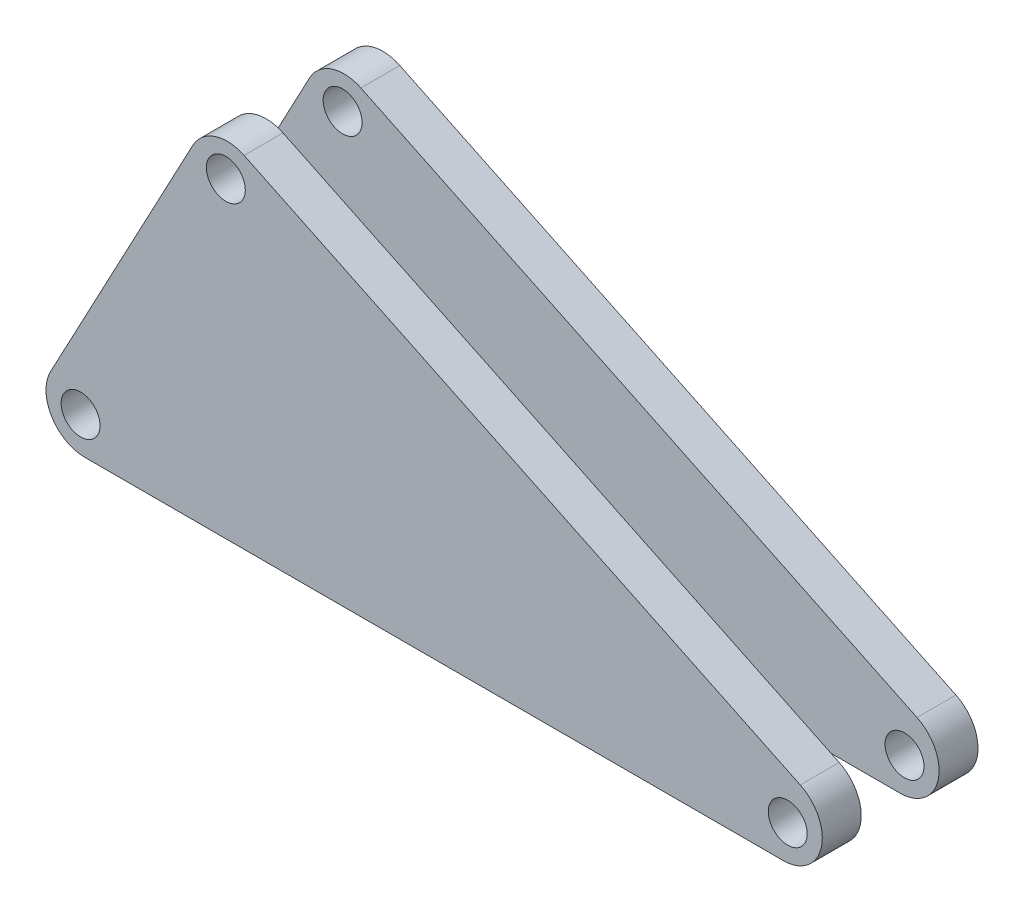
ISO-10303-21;
HEADER;
FILE_DESCRIPTION(('STEP AP214'),'2;1');
FILE_NAME('part.step','',(''),(''),'','','');
FILE_SCHEMA(('AUTOMOTIVE_DESIGN { 1 0 10303 214 1 1 1 1 }'));
ENDSEC;
DATA;
#1=APPLICATION_CONTEXT('core data for automotive mechanical design processes');
#2=APPLICATION_PROTOCOL_DEFINITION('international standard','automotive_design',2000,#1);
#3=PRODUCT_CONTEXT('',#1,'mechanical');
#4=PRODUCT('Part','Part','',(#3));
#5=PRODUCT_RELATED_PRODUCT_CATEGORY('part','',(#4));
#6=PRODUCT_DEFINITION_FORMATION('','',#4);
#7=PRODUCT_DEFINITION_CONTEXT('part definition',#1,'design');
#8=PRODUCT_DEFINITION('design','',#6,#7);
#9=PRODUCT_DEFINITION_SHAPE('','',#8);
#10=(LENGTH_UNIT() NAMED_UNIT(*) SI_UNIT(.MILLI.,.METRE.));
#11=(NAMED_UNIT(*) PLANE_ANGLE_UNIT() SI_UNIT($,.RADIAN.));
#12=(NAMED_UNIT(*) SI_UNIT($,.STERADIAN.) SOLID_ANGLE_UNIT());
#13=UNCERTAINTY_MEASURE_WITH_UNIT(LENGTH_MEASURE(1.E-05),#10,'distance_accuracy_value','');
#14=(GEOMETRIC_REPRESENTATION_CONTEXT(3) GLOBAL_UNCERTAINTY_ASSIGNED_CONTEXT((#13)) GLOBAL_UNIT_ASSIGNED_CONTEXT((#10,
#11,#12)) REPRESENTATION_CONTEXT('',''));
#15=CARTESIAN_POINT('',(0.,0.,0.));
#16=DIRECTION('',(0.,0.,1.));
#17=DIRECTION('',(1.,0.,0.));
#18=AXIS2_PLACEMENT_3D('',#15,#16,#17);
#19=CARTESIAN_POINT('',(191.1,-91.7866548034081,40.));
#20=DIRECTION('',(-0.432955918884,-0.901415094339623,0.));
#21=DIRECTION('',(0.901415094339623,-0.432955918884,0.));
#22=AXIS2_PLACEMENT_3D('',#19,#20,#21);
#23=PLANE('',#22);
#24=DIRECTION('',(0.,0.,-1.));
#25=VECTOR('',#24,1.);
#26=CARTESIAN_POINT('',(8.64554609182158,-4.15251572327044,40.));
#27=LINE('',#26,#25);
#28=CARTESIAN_POINT('',(8.64554609182158,-4.15251572327044,0.));
#29=VERTEX_POINT('',#28);
#30=CARTESIAN_POINT('',(8.64554609182158,-4.15251572327044,10.));
#31=VERTEX_POINT('',#30);
#32=EDGE_CURVE('E124',#29,#31,#27,.F.);
#33=ORIENTED_EDGE('',*,*,#32,.T.);
#34=DIRECTION('',(0.901415094339623,-0.432955918884001,0.));
#35=VECTOR('',#34,1.);
#36=CARTESIAN_POINT('',(191.1,-91.7866548034081,10.));
#37=LINE('',#36,#35);
#38=CARTESIAN_POINT('',(151.512499474291,-72.7725038600119,10.));
#39=VERTEX_POINT('',#38);
#40=EDGE_CURVE('E108',#31,#39,#37,.T.);
#41=ORIENTED_EDGE('',*,*,#40,.T.);
#42=DIRECTION('',(0.,0.,-1.));
#43=VECTOR('',#42,1.);
#44=CARTESIAN_POINT('',(151.512499474291,-72.7725038600119,40.));
#45=LINE('',#44,#43);
#46=CARTESIAN_POINT('',(151.512499474291,-72.7725038600119,0.));
#47=VERTEX_POINT('',#46);
#48=EDGE_CURVE('E122',#39,#47,#45,.T.);
#49=ORIENTED_EDGE('',*,*,#48,.T.);
#50=DIRECTION('',(-0.901415094339623,0.432955918884,0.));
#51=VECTOR('',#50,1.);
#52=CARTESIAN_POINT('',(191.1,-91.7866548034081,0.));
#53=LINE('',#52,#51);
#54=EDGE_CURVE('E127',#47,#29,#53,.T.);
#55=ORIENTED_EDGE('',*,*,#54,.T.);
#56=EDGE_LOOP('',(#33,#41,#49,#55));
#57=FACE_BOUND('',#56,.T.);
#58=ADVANCED_FACE('F43',(#57),#23,.F.);
#59=CARTESIAN_POINT('',(0.,0.,40.));
#60=DIRECTION('',(0.882563988494309,-0.470192307692308,0.));
#61=DIRECTION('',(0.470192307692308,0.882563988494309,0.));
#62=AXIS2_PLACEMENT_3D('',#59,#60,#61);
#63=PLANE('',#62);
#64=DIRECTION('',(0.,0.,-1.));
#65=VECTOR('',#64,1.);
#66=CARTESIAN_POINT('',(-41.0674448208037,-77.084731726485,40.));
#67=LINE('',#66,#65);
#68=CARTESIAN_POINT('',(-41.0674448208037,-77.084731726485,0.));
#69=VERTEX_POINT('',#68);
#70=CARTESIAN_POINT('',(-41.0674448208037,-77.084731726485,10.));
#71=VERTEX_POINT('',#70);
#72=EDGE_CURVE('E129',#69,#71,#67,.F.);
#73=ORIENTED_EDGE('',*,*,#72,.T.);
#74=DIRECTION('',(0.470192307692308,0.882563988494309,0.));
#75=VECTOR('',#74,1.);
#76=CARTESIAN_POINT('',(0.,0.,10.));
#77=LINE('',#76,#75);
#78=CARTESIAN_POINT('',(-4.50965298196151,-8.46474358974359,10.));
#79=VERTEX_POINT('',#78);
#80=EDGE_CURVE('E61',#71,#79,#77,.T.);
#81=ORIENTED_EDGE('',*,*,#80,.T.);
#82=DIRECTION('',(0.,0.,-1.));
#83=VECTOR('',#82,1.);
#84=CARTESIAN_POINT('',(-4.50965298196151,-8.46474358974359,40.));
#85=LINE('',#84,#83);
#86=CARTESIAN_POINT('',(-4.50965298196151,-8.46474358974359,0.));
#87=VERTEX_POINT('',#86);
#88=EDGE_CURVE('E101',#79,#87,#85,.T.);
#89=ORIENTED_EDGE('',*,*,#88,.T.);
#90=DIRECTION('',(-0.470192307692308,-0.882563988494309,0.));
#91=VECTOR('',#90,1.);
#92=CARTESIAN_POINT('',(0.,0.,0.));
#93=LINE('',#92,#91);
#94=EDGE_CURVE('E137',#87,#69,#93,.T.);
#95=ORIENTED_EDGE('',*,*,#94,.T.);
#96=EDGE_LOOP('',(#73,#81,#89,#95));
#97=FACE_BOUND('',#96,.T.);
#98=ADVANCED_FACE('F174',(#97),#63,.F.);
#99=CARTESIAN_POINT('',(-48.9,-91.7866548034081,40.));
#100=DIRECTION('',(0.,1.,0.));
#101=DIRECTION('',(0.,0.,1.));
#102=AXIS2_PLACEMENT_3D('',#99,#100,#101);
#103=PLANE('',#102);
#104=DIRECTION('',(0.,0.,-1.));
#105=VECTOR('',#104,1.);
#106=CARTESIAN_POINT('',(147.182940285451,-91.7866548034081,40.));
#107=LINE('',#106,#105);
#108=CARTESIAN_POINT('',(147.182940285451,-91.7866548034081,0.));
#109=VERTEX_POINT('',#108);
#110=CARTESIAN_POINT('',(147.182940285451,-91.7866548034081,10.));
#111=VERTEX_POINT('',#110);
#112=EDGE_CURVE('E47',#109,#111,#107,.F.);
#113=ORIENTED_EDGE('',*,*,#112,.T.);
#114=DIRECTION('',(-1.,0.,0.));
#115=VECTOR('',#114,1.);
#116=CARTESIAN_POINT('',(371.115917602972,-91.7866548034081,9.99999999999998));
#117=LINE('',#116,#115);
#118=CARTESIAN_POINT('',(-32.2418049358605,-91.7866548034081,10.));
#119=VERTEX_POINT('',#118);
#120=EDGE_CURVE('E113',#111,#119,#117,.T.);
#121=ORIENTED_EDGE('',*,*,#120,.T.);
#122=DIRECTION('',(0.,0.,-1.));
#123=VECTOR('',#122,1.);
#124=CARTESIAN_POINT('',(-32.2418049358606,-91.7866548034081,40.));
#125=LINE('',#124,#123);
#126=CARTESIAN_POINT('',(-32.2418049358606,-91.7866548034081,0.));
#127=VERTEX_POINT('',#126);
#128=EDGE_CURVE('E92',#119,#127,#125,.T.);
#129=ORIENTED_EDGE('',*,*,#128,.T.);
#130=DIRECTION('',(1.,0.,0.));
#131=VECTOR('',#130,1.);
#132=CARTESIAN_POINT('',(-48.9,-91.7866548034081,0.));
#133=LINE('',#132,#131);
#134=EDGE_CURVE('E138',#127,#109,#133,.T.);
#135=ORIENTED_EDGE('',*,*,#134,.T.);
#136=EDGE_LOOP('',(#113,#121,#129,#135));
#137=FACE_BOUND('',#136,.T.);
#138=ADVANCED_FACE('F177',(#137),#103,.F.);
#139=CARTESIAN_POINT('',(-32.2418049358606,-81.7866548034081,40.));
#140=DIRECTION('',(0.,0.,-1.));
#141=DIRECTION('',(-1.,0.,0.));
#142=AXIS2_PLACEMENT_3D('',#139,#140,#141);
#143=CYLINDRICAL_SURFACE('',#142,10.);
#144=CARTESIAN_POINT('',(-32.2418049358606,-81.7866548034081,10.));
#145=DIRECTION('',(0.,0.,-1.));
#146=DIRECTION('',(-1.,0.,0.));
#147=AXIS2_PLACEMENT_3D('',#144,#145,#146);
#148=CIRCLE('',#147,10.);
#149=EDGE_CURVE('E71',#71,#119,#148,.F.);
#150=ORIENTED_EDGE('',*,*,#149,.F.);
#151=ORIENTED_EDGE('',*,*,#72,.F.);
#152=CARTESIAN_POINT('',(-32.2418049358606,-81.7866548034081,0.));
#153=DIRECTION('',(0.,0.,1.));
#154=DIRECTION('',(1.,0.,0.));
#155=AXIS2_PLACEMENT_3D('',#152,#153,#154);
#156=CIRCLE('',#155,10.);
#157=EDGE_CURVE('E149',#127,#69,#156,.F.);
#158=ORIENTED_EDGE('',*,*,#157,.F.);
#159=ORIENTED_EDGE('',*,*,#128,.F.);
#160=EDGE_LOOP('',(#150,#151,#158,#159));
#161=FACE_BOUND('',#160,.T.);
#162=ADVANCED_FACE('F176',(#161),#143,.T.);
#163=CARTESIAN_POINT('',(147.182940285451,-81.7866548034081,40.));
#164=DIRECTION('',(0.,0.,-1.));
#165=DIRECTION('',(-1.,0.,0.));
#166=AXIS2_PLACEMENT_3D('',#163,#164,#165);
#167=CYLINDRICAL_SURFACE('',#166,10.);
#168=CARTESIAN_POINT('',(147.182940285451,-81.7866548034081,10.));
#169=DIRECTION('',(0.,0.,-1.));
#170=DIRECTION('',(-1.,0.,0.));
#171=AXIS2_PLACEMENT_3D('',#168,#169,#170);
#172=CIRCLE('',#171,10.);
#173=EDGE_CURVE('E53',#111,#39,#172,.F.);
#174=ORIENTED_EDGE('',*,*,#173,.F.);
#175=ORIENTED_EDGE('',*,*,#112,.F.);
#176=CARTESIAN_POINT('',(147.182940285451,-81.7866548034081,0.));
#177=DIRECTION('',(0.,0.,1.));
#178=DIRECTION('',(1.,0.,0.));
#179=AXIS2_PLACEMENT_3D('',#176,#177,#178);
#180=CIRCLE('',#179,10.);
#181=EDGE_CURVE('E80',#47,#109,#180,.F.);
#182=ORIENTED_EDGE('',*,*,#181,.F.);
#183=ORIENTED_EDGE('',*,*,#48,.F.);
#184=EDGE_LOOP('',(#174,#175,#182,#183));
#185=FACE_BOUND('',#184,.T.);
#186=ADVANCED_FACE('F126',(#185),#167,.T.);
#187=CARTESIAN_POINT('',(4.31598690298157,-13.1666666666667,40.));
#188=DIRECTION('',(0.,0.,-1.));
#189=DIRECTION('',(-1.,0.,0.));
#190=AXIS2_PLACEMENT_3D('',#187,#188,#189);
#191=CYLINDRICAL_SURFACE('',#190,10.);
#192=CARTESIAN_POINT('',(4.31598690298157,-13.1666666666667,10.));
#193=DIRECTION('',(0.,0.,-1.));
#194=DIRECTION('',(-1.,0.,0.));
#195=AXIS2_PLACEMENT_3D('',#192,#193,#194);
#196=CIRCLE('',#195,10.);
#197=EDGE_CURVE('E12',#31,#79,#196,.F.);
#198=ORIENTED_EDGE('',*,*,#197,.F.);
#199=ORIENTED_EDGE('',*,*,#32,.F.);
#200=CARTESIAN_POINT('',(4.31598690298157,-13.1666666666667,0.));
#201=DIRECTION('',(0.,0.,1.));
#202=DIRECTION('',(1.,0.,0.));
#203=AXIS2_PLACEMENT_3D('',#200,#201,#202);
#204=CIRCLE('',#203,10.);
#205=EDGE_CURVE('E170',#87,#29,#204,.F.);
#206=ORIENTED_EDGE('',*,*,#205,.F.);
#207=ORIENTED_EDGE('',*,*,#88,.F.);
#208=EDGE_LOOP('',(#198,#199,#206,#207));
#209=FACE_BOUND('',#208,.T.);
#210=ADVANCED_FACE('F173',(#209),#191,.T.);
#211=CARTESIAN_POINT('',(3.95911389573601,-11.7097378225911,0.));
#212=DIRECTION('',(0.,0.,1.));
#213=DIRECTION('',(1.,0.,0.));
#214=AXIS2_PLACEMENT_3D('',#211,#212,#213);
#215=CYLINDRICAL_SURFACE('',#214,5.);
#216=CARTESIAN_POINT('',(3.95911389573601,-11.7097378225911,10.));
#217=DIRECTION('',(0.,0.,-1.));
#218=DIRECTION('',(-1.,0.,0.));
#219=AXIS2_PLACEMENT_3D('',#216,#217,#218);
#220=CIRCLE('',#219,5.);
#221=CARTESIAN_POINT('',(-1.04088610426399,-11.7097378225911,10.));
#222=VERTEX_POINT('',#221);
#223=EDGE_CURVE('E139',#222,#222,#220,.F.);
#224=ORIENTED_EDGE('',*,*,#223,.T.);
#225=EDGE_LOOP('',(#224));
#226=FACE_BOUND('',#225,.T.);
#227=CARTESIAN_POINT('',(3.95911389573601,-11.7097378225911,0.));
#228=DIRECTION('',(0.,0.,1.));
#229=DIRECTION('',(1.,0.,0.));
#230=AXIS2_PLACEMENT_3D('',#227,#228,#229);
#231=CIRCLE('',#230,5.);
#232=CARTESIAN_POINT('',(8.95911389573601,-11.7097378225911,0.));
#233=VERTEX_POINT('',#232);
#234=EDGE_CURVE('E146',#233,#233,#231,.T.);
#235=ORIENTED_EDGE('',*,*,#234,.F.);
#236=EDGE_LOOP('',(#235));
#237=FACE_BOUND('',#236,.T.);
#238=ADVANCED_FACE('F192',(#226,#237),#215,.F.);
#239=CARTESIAN_POINT('',(-33.3598389246105,-82.7866548034081,0.));
#240=DIRECTION('',(0.,0.,1.));
#241=DIRECTION('',(1.,0.,0.));
#242=AXIS2_PLACEMENT_3D('',#239,#240,#241);
#243=CYLINDRICAL_SURFACE('',#242,5.);
#244=CARTESIAN_POINT('',(-33.3598389246105,-82.7866548034081,10.));
#245=DIRECTION('',(0.,0.,-1.));
#246=DIRECTION('',(-1.,0.,0.));
#247=AXIS2_PLACEMENT_3D('',#244,#245,#246);
#248=CIRCLE('',#247,5.);
#249=CARTESIAN_POINT('',(-38.3598389246105,-82.7866548034081,10.));
#250=VERTEX_POINT('',#249);
#251=EDGE_CURVE('E160',#250,#250,#248,.F.);
#252=ORIENTED_EDGE('',*,*,#251,.T.);
#253=EDGE_LOOP('',(#252));
#254=FACE_BOUND('',#253,.T.);
#255=CARTESIAN_POINT('',(-33.3598389246105,-82.7866548034081,0.));
#256=DIRECTION('',(0.,0.,1.));
#257=DIRECTION('',(1.,0.,0.));
#258=AXIS2_PLACEMENT_3D('',#255,#256,#257);
#259=CIRCLE('',#258,5.);
#260=CARTESIAN_POINT('',(-28.3598389246105,-82.7866548034081,0.));
#261=VERTEX_POINT('',#260);
#262=EDGE_CURVE('E150',#261,#261,#259,.T.);
#263=ORIENTED_EDGE('',*,*,#262,.F.);
#264=EDGE_LOOP('',(#263));
#265=FACE_BOUND('',#264,.T.);
#266=ADVANCED_FACE('F194',(#254,#265),#243,.F.);
#267=CARTESIAN_POINT('',(148.300974274201,-82.7866548034081,0.));
#268=DIRECTION('',(0.,0.,1.));
#269=DIRECTION('',(1.,0.,0.));
#270=AXIS2_PLACEMENT_3D('',#267,#268,#269);
#271=CYLINDRICAL_SURFACE('',#270,5.00000000000002);
#272=CARTESIAN_POINT('',(148.300974274201,-82.7866548034081,10.));
#273=DIRECTION('',(0.,0.,-1.));
#274=DIRECTION('',(-1.,0.,0.));
#275=AXIS2_PLACEMENT_3D('',#272,#273,#274);
#276=CIRCLE('',#275,5.00000000000002);
#277=CARTESIAN_POINT('',(143.300974274201,-82.7866548034081,10.));
#278=VERTEX_POINT('',#277);
#279=EDGE_CURVE('E156',#278,#278,#276,.F.);
#280=ORIENTED_EDGE('',*,*,#279,.T.);
#281=EDGE_LOOP('',(#280));
#282=FACE_BOUND('',#281,.T.);
#283=CARTESIAN_POINT('',(148.300974274201,-82.7866548034081,0.));
#284=DIRECTION('',(0.,0.,1.));
#285=DIRECTION('',(1.,0.,0.));
#286=AXIS2_PLACEMENT_3D('',#283,#284,#285);
#287=CIRCLE('',#286,5.00000000000002);
#288=CARTESIAN_POINT('',(153.300974274201,-82.7866548034081,0.));
#289=VERTEX_POINT('',#288);
#290=EDGE_CURVE('E153',#289,#289,#287,.T.);
#291=ORIENTED_EDGE('',*,*,#290,.F.);
#292=EDGE_LOOP('',(#291));
#293=FACE_BOUND('',#292,.T.);
#294=ADVANCED_FACE('F45',(#282,#293),#271,.F.);
#295=CARTESIAN_POINT('',(0.,0.,0.));
#296=DIRECTION('',(0.,0.,1.));
#297=DIRECTION('',(1.,0.,0.));
#298=AXIS2_PLACEMENT_3D('',#295,#296,#297);
#299=PLANE('',#298);
#300=ORIENTED_EDGE('',*,*,#290,.T.);
#301=EDGE_LOOP('',(#300));
#302=FACE_BOUND('',#301,.T.);
#303=ORIENTED_EDGE('',*,*,#262,.T.);
#304=EDGE_LOOP('',(#303));
#305=FACE_BOUND('',#304,.T.);
#306=ORIENTED_EDGE('',*,*,#234,.T.);
#307=EDGE_LOOP('',(#306));
#308=FACE_BOUND('',#307,.T.);
#309=ORIENTED_EDGE('',*,*,#134,.F.);
#310=ORIENTED_EDGE('',*,*,#157,.T.);
#311=ORIENTED_EDGE('',*,*,#94,.F.);
#312=ORIENTED_EDGE('',*,*,#205,.T.);
#313=ORIENTED_EDGE('',*,*,#54,.F.);
#314=ORIENTED_EDGE('',*,*,#181,.T.);
#315=EDGE_LOOP('',(#309,#310,#311,#312,#313,#314));
#316=FACE_BOUND('',#315,.T.);
#317=ADVANCED_FACE('F171',(#302,#305,#308,#316),#299,.F.);
#318=CARTESIAN_POINT('',(371.115917602972,-91.7866548034081,9.99999999999998));
#319=DIRECTION('',(0.,0.,-1.));
#320=DIRECTION('',(-1.,0.,0.));
#321=AXIS2_PLACEMENT_3D('',#318,#319,#320);
#322=PLANE('',#321);
#323=ORIENTED_EDGE('',*,*,#149,.T.);
#324=ORIENTED_EDGE('',*,*,#120,.F.);
#325=ORIENTED_EDGE('',*,*,#173,.T.);
#326=ORIENTED_EDGE('',*,*,#40,.F.);
#327=ORIENTED_EDGE('',*,*,#197,.T.);
#328=ORIENTED_EDGE('',*,*,#80,.F.);
#329=EDGE_LOOP('',(#323,#324,#325,#326,#327,#328));
#330=FACE_BOUND('',#329,.T.);
#331=ORIENTED_EDGE('',*,*,#251,.F.);
#332=EDGE_LOOP('',(#331));
#333=FACE_BOUND('',#332,.T.);
#334=ORIENTED_EDGE('',*,*,#279,.F.);
#335=EDGE_LOOP('',(#334));
#336=FACE_BOUND('',#335,.T.);
#337=ORIENTED_EDGE('',*,*,#223,.F.);
#338=EDGE_LOOP('',(#337));
#339=FACE_BOUND('',#338,.T.);
#340=ADVANCED_FACE('F111',(#330,#333,#336,#339),#322,.F.);
#341=CLOSED_SHELL('',(#58,#98,#138,#162,#186,#210,#238,#266,#294,#317,#340));
#342=MANIFOLD_SOLID_BREP('B2',#341);
#343=CARTESIAN_POINT('',(147.182940285451,-81.7866548034081,40.));
#344=DIRECTION('',(0.,0.,-1.));
#345=DIRECTION('',(-1.,0.,0.));
#346=AXIS2_PLACEMENT_3D('',#343,#344,#345);
#347=CYLINDRICAL_SURFACE('',#346,10.);
#348=CARTESIAN_POINT('',(147.182940285451,-81.7866548034081,30.));
#349=DIRECTION('',(0.,0.,1.));
#350=DIRECTION('',(1.,0.,0.));
#351=AXIS2_PLACEMENT_3D('',#348,#349,#350);
#352=CIRCLE('',#351,10.);
#353=CARTESIAN_POINT('',(151.512499474291,-72.7725038600119,30.));
#354=VERTEX_POINT('',#353);
#355=CARTESIAN_POINT('',(147.182940285451,-91.7866548034081,30.));
#356=VERTEX_POINT('',#355);
#357=EDGE_CURVE('E341',#354,#356,#352,.F.);
#358=ORIENTED_EDGE('',*,*,#357,.F.);
#359=DIRECTION('',(0.,0.,-1.));
#360=VECTOR('',#359,1.);
#361=CARTESIAN_POINT('',(151.512499474291,-72.7725038600119,40.));
#362=LINE('',#361,#360);
#363=CARTESIAN_POINT('',(151.512499474291,-72.7725038600119,40.));
#364=VERTEX_POINT('',#363);
#365=EDGE_CURVE('E41',#364,#354,#362,.T.);
#366=ORIENTED_EDGE('',*,*,#365,.F.);
#367=CARTESIAN_POINT('',(147.182940285451,-81.7866548034081,40.));
#368=DIRECTION('',(0.,0.,1.));
#369=DIRECTION('',(1.,0.,0.));
#370=AXIS2_PLACEMENT_3D('',#367,#368,#369);
#371=CIRCLE('',#370,10.);
#372=CARTESIAN_POINT('',(147.182940285451,-91.7866548034081,40.));
#373=VERTEX_POINT('',#372);
#374=EDGE_CURVE('E370',#373,#364,#371,.T.);
#375=ORIENTED_EDGE('',*,*,#374,.F.);
#376=DIRECTION('',(0.,0.,-1.));
#377=VECTOR('',#376,1.);
#378=CARTESIAN_POINT('',(147.182940285451,-91.7866548034081,40.));
#379=LINE('',#378,#377);
#380=EDGE_CURVE('E360',#356,#373,#379,.F.);
#381=ORIENTED_EDGE('',*,*,#380,.F.);
#382=EDGE_LOOP('',(#358,#366,#375,#381));
#383=FACE_BOUND('',#382,.T.);
#384=ADVANCED_FACE('F282',(#383),#347,.T.);
#385=CARTESIAN_POINT('',(-32.2418049358606,-81.7866548034081,40.));
#386=DIRECTION('',(0.,0.,-1.));
#387=DIRECTION('',(-1.,0.,0.));
#388=AXIS2_PLACEMENT_3D('',#385,#386,#387);
#389=CYLINDRICAL_SURFACE('',#388,10.);
#390=CARTESIAN_POINT('',(-32.2418049358606,-81.7866548034081,30.));
#391=DIRECTION('',(0.,0.,1.));
#392=DIRECTION('',(1.,0.,0.));
#393=AXIS2_PLACEMENT_3D('',#390,#391,#392);
#394=CIRCLE('',#393,10.);
#395=CARTESIAN_POINT('',(-32.2418049358605,-91.7866548034081,30.));
#396=VERTEX_POINT('',#395);
#397=CARTESIAN_POINT('',(-41.0674448208037,-77.084731726485,30.));
#398=VERTEX_POINT('',#397);
#399=EDGE_CURVE('E339',#396,#398,#394,.F.);
#400=ORIENTED_EDGE('',*,*,#399,.F.);
#401=DIRECTION('',(0.,0.,-1.));
#402=VECTOR('',#401,1.);
#403=CARTESIAN_POINT('',(-32.2418049358606,-91.7866548034081,40.));
#404=LINE('',#403,#402);
#405=CARTESIAN_POINT('',(-32.2418049358606,-91.7866548034081,40.));
#406=VERTEX_POINT('',#405);
#407=EDGE_CURVE('E351',#406,#396,#404,.T.);
#408=ORIENTED_EDGE('',*,*,#407,.F.);
#409=CARTESIAN_POINT('',(-32.2418049358606,-81.7866548034081,40.));
#410=DIRECTION('',(0.,0.,1.));
#411=DIRECTION('',(1.,0.,0.));
#412=AXIS2_PLACEMENT_3D('',#409,#410,#411);
#413=CIRCLE('',#412,10.);
#414=CARTESIAN_POINT('',(-41.0674448208037,-77.084731726485,40.));
#415=VERTEX_POINT('',#414);
#416=EDGE_CURVE('E372',#415,#406,#413,.T.);
#417=ORIENTED_EDGE('',*,*,#416,.F.);
#418=DIRECTION('',(0.,0.,-1.));
#419=VECTOR('',#418,1.);
#420=CARTESIAN_POINT('',(-41.0674448208037,-77.084731726485,40.));
#421=LINE('',#420,#419);
#422=EDGE_CURVE('E352',#398,#415,#421,.F.);
#423=ORIENTED_EDGE('',*,*,#422,.F.);
#424=EDGE_LOOP('',(#400,#408,#417,#423));
#425=FACE_BOUND('',#424,.T.);
#426=ADVANCED_FACE('F349',(#425),#389,.T.);
#427=CARTESIAN_POINT('',(-48.9,-91.7866548034081,40.));
#428=DIRECTION('',(0.,1.,0.));
#429=DIRECTION('',(0.,0.,1.));
#430=AXIS2_PLACEMENT_3D('',#427,#428,#429);
#431=PLANE('',#430);
#432=ORIENTED_EDGE('',*,*,#407,.T.);
#433=DIRECTION('',(1.,0.,0.));
#434=VECTOR('',#433,1.);
#435=CARTESIAN_POINT('',(371.115917602972,-91.7866548034081,30.));
#436=LINE('',#435,#434);
#437=EDGE_CURVE('E335',#396,#356,#436,.T.);
#438=ORIENTED_EDGE('',*,*,#437,.T.);
#439=ORIENTED_EDGE('',*,*,#380,.T.);
#440=DIRECTION('',(1.,0.,0.));
#441=VECTOR('',#440,1.);
#442=CARTESIAN_POINT('',(-48.9,-91.7866548034081,40.));
#443=LINE('',#442,#441);
#444=EDGE_CURVE('E358',#406,#373,#443,.T.);
#445=ORIENTED_EDGE('',*,*,#444,.F.);
#446=EDGE_LOOP('',(#432,#438,#439,#445));
#447=FACE_BOUND('',#446,.T.);
#448=ADVANCED_FACE('F356',(#447),#431,.F.);
#449=CARTESIAN_POINT('',(4.31598690298157,-13.1666666666667,40.));
#450=DIRECTION('',(0.,0.,-1.));
#451=DIRECTION('',(-1.,0.,0.));
#452=AXIS2_PLACEMENT_3D('',#449,#450,#451);
#453=CYLINDRICAL_SURFACE('',#452,10.);
#454=CARTESIAN_POINT('',(4.31598690298157,-13.1666666666667,30.));
#455=DIRECTION('',(0.,0.,1.));
#456=DIRECTION('',(1.,0.,0.));
#457=AXIS2_PLACEMENT_3D('',#454,#455,#456);
#458=CIRCLE('',#457,10.);
#459=CARTESIAN_POINT('',(-4.50965298196151,-8.46474358974359,30.));
#460=VERTEX_POINT('',#459);
#461=CARTESIAN_POINT('',(8.64554609182158,-4.15251572327044,30.));
#462=VERTEX_POINT('',#461);
#463=EDGE_CURVE('E399',#460,#462,#458,.F.);
#464=ORIENTED_EDGE('',*,*,#463,.F.);
#465=DIRECTION('',(0.,0.,-1.));
#466=VECTOR('',#465,1.);
#467=CARTESIAN_POINT('',(-4.50965298196151,-8.46474358974359,40.));
#468=LINE('',#467,#466);
#469=CARTESIAN_POINT('',(-4.50965298196151,-8.46474358974359,40.));
#470=VERTEX_POINT('',#469);
#471=EDGE_CURVE('E359',#470,#460,#468,.T.);
#472=ORIENTED_EDGE('',*,*,#471,.F.);
#473=CARTESIAN_POINT('',(4.31598690298157,-13.1666666666667,40.));
#474=DIRECTION('',(0.,0.,1.));
#475=DIRECTION('',(1.,0.,0.));
#476=AXIS2_PLACEMENT_3D('',#473,#474,#475);
#477=CIRCLE('',#476,10.);
#478=CARTESIAN_POINT('',(8.64554609182158,-4.15251572327044,40.));
#479=VERTEX_POINT('',#478);
#480=EDGE_CURVE('E368',#479,#470,#477,.T.);
#481=ORIENTED_EDGE('',*,*,#480,.F.);
#482=DIRECTION('',(0.,0.,-1.));
#483=VECTOR('',#482,1.);
#484=CARTESIAN_POINT('',(8.64554609182158,-4.15251572327044,40.));
#485=LINE('',#484,#483);
#486=EDGE_CURVE('E291',#462,#479,#485,.F.);
#487=ORIENTED_EDGE('',*,*,#486,.F.);
#488=EDGE_LOOP('',(#464,#472,#481,#487));
#489=FACE_BOUND('',#488,.T.);
#490=ADVANCED_FACE('F284',(#489),#453,.T.);
#491=CARTESIAN_POINT('',(0.,0.,40.));
#492=DIRECTION('',(0.882563988494309,-0.470192307692308,0.));
#493=DIRECTION('',(0.470192307692308,0.882563988494309,0.));
#494=AXIS2_PLACEMENT_3D('',#491,#492,#493);
#495=PLANE('',#494);
#496=ORIENTED_EDGE('',*,*,#471,.T.);
#497=DIRECTION('',(-0.470192307692308,-0.882563988494309,0.));
#498=VECTOR('',#497,1.);
#499=CARTESIAN_POINT('',(0.,0.,30.));
#500=LINE('',#499,#498);
#501=EDGE_CURVE('E298',#460,#398,#500,.T.);
#502=ORIENTED_EDGE('',*,*,#501,.T.);
#503=ORIENTED_EDGE('',*,*,#422,.T.);
#504=DIRECTION('',(-0.470192307692308,-0.882563988494309,0.));
#505=VECTOR('',#504,1.);
#506=CARTESIAN_POINT('',(0.,0.,40.));
#507=LINE('',#506,#505);
#508=EDGE_CURVE('E379',#470,#415,#507,.T.);
#509=ORIENTED_EDGE('',*,*,#508,.F.);
#510=EDGE_LOOP('',(#496,#502,#503,#509));
#511=FACE_BOUND('',#510,.T.);
#512=ADVANCED_FACE('F448',(#511),#495,.F.);
#513=CARTESIAN_POINT('',(191.1,-91.7866548034081,40.));
#514=DIRECTION('',(-0.432955918884,-0.901415094339623,0.));
#515=DIRECTION('',(0.901415094339623,-0.432955918884,0.));
#516=AXIS2_PLACEMENT_3D('',#513,#514,#515);
#517=PLANE('',#516);
#518=ORIENTED_EDGE('',*,*,#365,.T.);
#519=DIRECTION('',(-0.901415094339623,0.432955918884001,0.));
#520=VECTOR('',#519,1.);
#521=CARTESIAN_POINT('',(191.1,-91.7866548034081,30.));
#522=LINE('',#521,#520);
#523=EDGE_CURVE('E396',#354,#462,#522,.T.);
#524=ORIENTED_EDGE('',*,*,#523,.T.);
#525=ORIENTED_EDGE('',*,*,#486,.T.);
#526=DIRECTION('',(-0.901415094339623,0.432955918884,0.));
#527=VECTOR('',#526,1.);
#528=CARTESIAN_POINT('',(191.1,-91.7866548034081,40.));
#529=LINE('',#528,#527);
#530=EDGE_CURVE('E383',#364,#479,#529,.T.);
#531=ORIENTED_EDGE('',*,*,#530,.F.);
#532=EDGE_LOOP('',(#518,#524,#525,#531));
#533=FACE_BOUND('',#532,.T.);
#534=ADVANCED_FACE('F423',(#533),#517,.F.);
#535=CARTESIAN_POINT('',(3.95911389573601,-11.7097378225911,0.));
#536=DIRECTION('',(0.,0.,1.));
#537=DIRECTION('',(1.,0.,0.));
#538=AXIS2_PLACEMENT_3D('',#535,#536,#537);
#539=CYLINDRICAL_SURFACE('',#538,5.);
#540=CARTESIAN_POINT('',(3.95911389573601,-11.7097378225911,30.));
#541=DIRECTION('',(0.,0.,1.));
#542=DIRECTION('',(1.,0.,0.));
#543=AXIS2_PLACEMENT_3D('',#540,#541,#542);
#544=CIRCLE('',#543,5.);
#545=CARTESIAN_POINT('',(8.95911389573601,-11.7097378225911,30.));
#546=VERTEX_POINT('',#545);
#547=EDGE_CURVE('E401',#546,#546,#544,.F.);
#548=ORIENTED_EDGE('',*,*,#547,.T.);
#549=EDGE_LOOP('',(#548));
#550=FACE_BOUND('',#549,.T.);
#551=CARTESIAN_POINT('',(3.95911389573601,-11.7097378225911,40.));
#552=DIRECTION('',(0.,0.,1.));
#553=DIRECTION('',(1.,0.,0.));
#554=AXIS2_PLACEMENT_3D('',#551,#552,#553);
#555=CIRCLE('',#554,5.);
#556=CARTESIAN_POINT('',(8.95911389573601,-11.7097378225911,40.));
#557=VERTEX_POINT('',#556);
#558=EDGE_CURVE('E385',#557,#557,#555,.T.);
#559=ORIENTED_EDGE('',*,*,#558,.T.);
#560=EDGE_LOOP('',(#559));
#561=FACE_BOUND('',#560,.T.);
#562=ADVANCED_FACE('F419',(#550,#561),#539,.F.);
#563=CARTESIAN_POINT('',(-33.3598389246105,-82.7866548034081,0.));
#564=DIRECTION('',(0.,0.,1.));
#565=DIRECTION('',(1.,0.,0.));
#566=AXIS2_PLACEMENT_3D('',#563,#564,#565);
#567=CYLINDRICAL_SURFACE('',#566,5.);
#568=CARTESIAN_POINT('',(-33.3598389246105,-82.7866548034081,30.));
#569=DIRECTION('',(0.,0.,1.));
#570=DIRECTION('',(1.,0.,0.));
#571=AXIS2_PLACEMENT_3D('',#568,#569,#570);
#572=CIRCLE('',#571,5.);
#573=CARTESIAN_POINT('',(-28.3598389246105,-82.7866548034081,30.));
#574=VERTEX_POINT('',#573);
#575=EDGE_CURVE('E404',#574,#574,#572,.F.);
#576=ORIENTED_EDGE('',*,*,#575,.T.);
#577=EDGE_LOOP('',(#576));
#578=FACE_BOUND('',#577,.T.);
#579=CARTESIAN_POINT('',(-33.3598389246105,-82.7866548034081,40.));
#580=DIRECTION('',(0.,0.,1.));
#581=DIRECTION('',(1.,0.,0.));
#582=AXIS2_PLACEMENT_3D('',#579,#580,#581);
#583=CIRCLE('',#582,5.);
#584=CARTESIAN_POINT('',(-28.3598389246105,-82.7866548034081,40.));
#585=VERTEX_POINT('',#584);
#586=EDGE_CURVE('E390',#585,#585,#583,.T.);
#587=ORIENTED_EDGE('',*,*,#586,.T.);
#588=EDGE_LOOP('',(#587));
#589=FACE_BOUND('',#588,.T.);
#590=ADVANCED_FACE('F422',(#578,#589),#567,.F.);
#591=CARTESIAN_POINT('',(0.,0.,40.));
#592=DIRECTION('',(0.,0.,1.));
#593=DIRECTION('',(1.,0.,0.));
#594=AXIS2_PLACEMENT_3D('',#591,#592,#593);
#595=PLANE('',#594);
#596=CARTESIAN_POINT('',(148.300974274201,-82.7866548034081,40.));
#597=DIRECTION('',(0.,0.,1.));
#598=DIRECTION('',(1.,0.,0.));
#599=AXIS2_PLACEMENT_3D('',#596,#597,#598);
#600=CIRCLE('',#599,5.00000000000002);
#601=CARTESIAN_POINT('',(153.300974274201,-82.7866548034081,40.));
#602=VERTEX_POINT('',#601);
#603=EDGE_CURVE('E353',#602,#602,#600,.T.);
#604=ORIENTED_EDGE('',*,*,#603,.F.);
#605=EDGE_LOOP('',(#604));
#606=FACE_BOUND('',#605,.T.);
#607=ORIENTED_EDGE('',*,*,#586,.F.);
#608=EDGE_LOOP('',(#607));
#609=FACE_BOUND('',#608,.T.);
#610=ORIENTED_EDGE('',*,*,#558,.F.);
#611=EDGE_LOOP('',(#610));
#612=FACE_BOUND('',#611,.T.);
#613=ORIENTED_EDGE('',*,*,#508,.T.);
#614=ORIENTED_EDGE('',*,*,#416,.T.);
#615=ORIENTED_EDGE('',*,*,#444,.T.);
#616=ORIENTED_EDGE('',*,*,#374,.T.);
#617=ORIENTED_EDGE('',*,*,#530,.T.);
#618=ORIENTED_EDGE('',*,*,#480,.T.);
#619=EDGE_LOOP('',(#613,#614,#615,#616,#617,#618));
#620=FACE_BOUND('',#619,.T.);
#621=ADVANCED_FACE('F376',(#606,#609,#612,#620),#595,.T.);
#622=CARTESIAN_POINT('',(148.300974274201,-82.7866548034081,0.));
#623=DIRECTION('',(0.,0.,1.));
#624=DIRECTION('',(1.,0.,0.));
#625=AXIS2_PLACEMENT_3D('',#622,#623,#624);
#626=CYLINDRICAL_SURFACE('',#625,5.00000000000002);
#627=CARTESIAN_POINT('',(148.300974274201,-82.7866548034081,30.));
#628=DIRECTION('',(0.,0.,1.));
#629=DIRECTION('',(1.,0.,0.));
#630=AXIS2_PLACEMENT_3D('',#627,#628,#629);
#631=CIRCLE('',#630,5.00000000000002);
#632=CARTESIAN_POINT('',(153.300974274201,-82.7866548034081,30.));
#633=VERTEX_POINT('',#632);
#634=EDGE_CURVE('E286',#633,#633,#631,.F.);
#635=ORIENTED_EDGE('',*,*,#634,.T.);
#636=EDGE_LOOP('',(#635));
#637=FACE_BOUND('',#636,.T.);
#638=ORIENTED_EDGE('',*,*,#603,.T.);
#639=EDGE_LOOP('',(#638));
#640=FACE_BOUND('',#639,.T.);
#641=ADVANCED_FACE('F411',(#637,#640),#626,.F.);
#642=CARTESIAN_POINT('',(371.115917602972,-91.7866548034081,30.));
#643=DIRECTION('',(0.,0.,1.));
#644=DIRECTION('',(1.,0.,0.));
#645=AXIS2_PLACEMENT_3D('',#642,#643,#644);
#646=PLANE('',#645);
#647=ORIENTED_EDGE('',*,*,#399,.T.);
#648=ORIENTED_EDGE('',*,*,#501,.F.);
#649=ORIENTED_EDGE('',*,*,#463,.T.);
#650=ORIENTED_EDGE('',*,*,#523,.F.);
#651=ORIENTED_EDGE('',*,*,#357,.T.);
#652=ORIENTED_EDGE('',*,*,#437,.F.);
#653=EDGE_LOOP('',(#647,#648,#649,#650,#651,#652));
#654=FACE_BOUND('',#653,.T.);
#655=ORIENTED_EDGE('',*,*,#575,.F.);
#656=EDGE_LOOP('',(#655));
#657=FACE_BOUND('',#656,.T.);
#658=ORIENTED_EDGE('',*,*,#634,.F.);
#659=EDGE_LOOP('',(#658));
#660=FACE_BOUND('',#659,.T.);
#661=ORIENTED_EDGE('',*,*,#547,.F.);
#662=EDGE_LOOP('',(#661));
#663=FACE_BOUND('',#662,.T.);
#664=ADVANCED_FACE('F337',(#654,#657,#660,#663),#646,.F.);
#665=CLOSED_SHELL('',(#384,#426,#448,#490,#512,#534,#562,#590,#621,#641,#664));
#666=MANIFOLD_SOLID_BREP('B6',#665);
#667=ADVANCED_BREP_SHAPE_REPRESENTATION('',(#18,#342,#666),#14);
#668=SHAPE_DEFINITION_REPRESENTATION(#9,#667);
ENDSEC;
END-ISO-10303-21;
